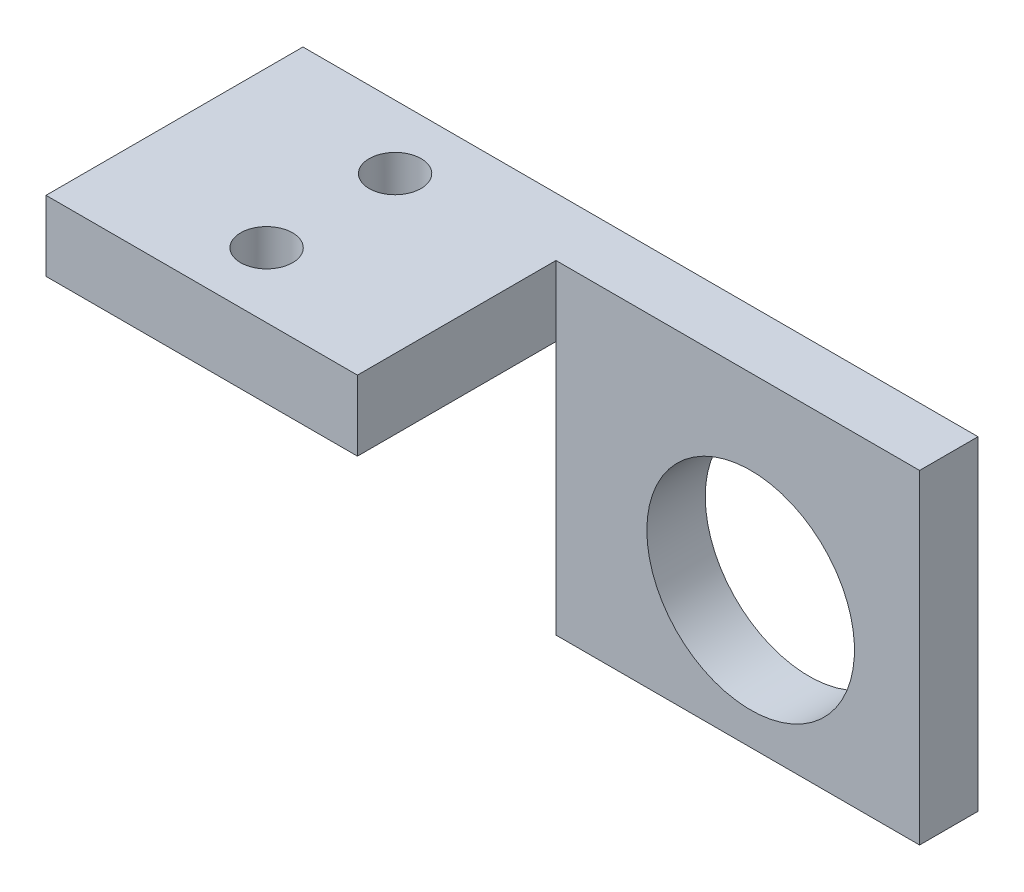
ISO-10303-21;
HEADER;
FILE_DESCRIPTION(('STEP AP214'),'2;1');
FILE_NAME('part.step','',(''),(''),'','','');
FILE_SCHEMA(('AUTOMOTIVE_DESIGN { 1 0 10303 214 1 1 1 1 }'));
ENDSEC;
DATA;
#1=APPLICATION_CONTEXT('core data for automotive mechanical design processes');
#2=APPLICATION_PROTOCOL_DEFINITION('international standard','automotive_design',2000,#1);
#3=PRODUCT_CONTEXT('',#1,'mechanical');
#4=PRODUCT('Part','Part','',(#3));
#5=PRODUCT_RELATED_PRODUCT_CATEGORY('part','',(#4));
#6=PRODUCT_DEFINITION_FORMATION('','',#4);
#7=PRODUCT_DEFINITION_CONTEXT('part definition',#1,'design');
#8=PRODUCT_DEFINITION('design','',#6,#7);
#9=PRODUCT_DEFINITION_SHAPE('','',#8);
#10=(LENGTH_UNIT() NAMED_UNIT(*) SI_UNIT(.MILLI.,.METRE.));
#11=(NAMED_UNIT(*) PLANE_ANGLE_UNIT() SI_UNIT($,.RADIAN.));
#12=(NAMED_UNIT(*) SI_UNIT($,.STERADIAN.) SOLID_ANGLE_UNIT());
#13=UNCERTAINTY_MEASURE_WITH_UNIT(LENGTH_MEASURE(1.E-05),#10,'distance_accuracy_value','');
#14=(GEOMETRIC_REPRESENTATION_CONTEXT(3) GLOBAL_UNCERTAINTY_ASSIGNED_CONTEXT((#13)) GLOBAL_UNIT_ASSIGNED_CONTEXT((#10,
#11,#12)) REPRESENTATION_CONTEXT('',''));
#15=CARTESIAN_POINT('',(0.,0.,0.));
#16=DIRECTION('',(0.,0.,1.));
#17=DIRECTION('',(1.,0.,0.));
#18=AXIS2_PLACEMENT_3D('',#15,#16,#17);
#19=CARTESIAN_POINT('',(0.,0.,4.8));
#20=DIRECTION('',(1.,0.,0.));
#21=DIRECTION('',(0.,1.,0.));
#22=AXIS2_PLACEMENT_3D('',#19,#20,#21);
#23=PLANE('',#22);
#24=DIRECTION('',(0.,0.,-1.));
#25=VECTOR('',#24,1.);
#26=CARTESIAN_POINT('',(0.,0.,4.8));
#27=LINE('',#26,#25);
#28=CARTESIAN_POINT('',(0.,0.,4.5));
#29=VERTEX_POINT('',#28);
#30=CARTESIAN_POINT('',(0.,0.,0.));
#31=VERTEX_POINT('',#30);
#32=EDGE_CURVE('E50',#29,#31,#27,.T.);
#33=ORIENTED_EDGE('',*,*,#32,.F.);
#34=DIRECTION('',(0.,1.,0.));
#35=VECTOR('',#34,1.);
#36=CARTESIAN_POINT('',(0.,-75.,4.5));
#37=LINE('',#36,#35);
#38=CARTESIAN_POINT('',(0.,19.59,4.5));
#39=VERTEX_POINT('',#38);
#40=EDGE_CURVE('E213',#29,#39,#37,.T.);
#41=ORIENTED_EDGE('',*,*,#40,.T.);
#42=DIRECTION('',(0.,0.,-1.));
#43=VECTOR('',#42,1.);
#44=CARTESIAN_POINT('',(0.,19.59,19.8));
#45=LINE('',#44,#43);
#46=CARTESIAN_POINT('',(0.,19.59,0.));
#47=VERTEX_POINT('',#46);
#48=EDGE_CURVE('E131',#39,#47,#45,.T.);
#49=ORIENTED_EDGE('',*,*,#48,.T.);
#50=DIRECTION('',(0.,-1.,0.));
#51=VECTOR('',#50,1.);
#52=CARTESIAN_POINT('',(0.,0.,0.));
#53=LINE('',#52,#51);
#54=EDGE_CURVE('E171',#47,#31,#53,.T.);
#55=ORIENTED_EDGE('',*,*,#54,.T.);
#56=EDGE_LOOP('',(#33,#41,#49,#55));
#57=FACE_BOUND('',#56,.T.);
#58=ADVANCED_FACE('F41',(#57),#23,.F.);
#59=CARTESIAN_POINT('',(0.,0.,4.8));
#60=DIRECTION('',(0.,1.,0.));
#61=DIRECTION('',(-1.,0.,0.));
#62=AXIS2_PLACEMENT_3D('',#59,#60,#61);
#63=PLANE('',#62);
#64=DIRECTION('',(0.,0.,-1.));
#65=VECTOR('',#64,1.);
#66=CARTESIAN_POINT('',(28.0184548601934,0.,200.));
#67=LINE('',#66,#65);
#68=CARTESIAN_POINT('',(28.0184548601934,0.,4.5));
#69=VERTEX_POINT('',#68);
#70=CARTESIAN_POINT('',(28.0184548601934,0.,0.));
#71=VERTEX_POINT('',#70);
#72=EDGE_CURVE('E64',#69,#71,#67,.T.);
#73=ORIENTED_EDGE('',*,*,#72,.F.);
#74=DIRECTION('',(-1.,0.,0.));
#75=VECTOR('',#74,1.);
#76=CARTESIAN_POINT('',(0.,0.,4.5));
#77=LINE('',#76,#75);
#78=EDGE_CURVE('E145',#69,#29,#77,.T.);
#79=ORIENTED_EDGE('',*,*,#78,.T.);
#80=ORIENTED_EDGE('',*,*,#32,.T.);
#81=DIRECTION('',(1.,0.,0.));
#82=VECTOR('',#81,1.);
#83=CARTESIAN_POINT('',(0.,0.,0.));
#84=LINE('',#83,#82);
#85=EDGE_CURVE('E175',#31,#71,#84,.T.);
#86=ORIENTED_EDGE('',*,*,#85,.T.);
#87=EDGE_LOOP('',(#73,#79,#80,#86));
#88=FACE_BOUND('',#87,.T.);
#89=ADVANCED_FACE('F202',(#88),#63,.F.);
#90=CARTESIAN_POINT('',(-23.9999999999999,0.,4.8));
#91=DIRECTION('',(1.,0.,0.));
#92=DIRECTION('',(0.,1.,0.));
#93=AXIS2_PLACEMENT_3D('',#90,#91,#92);
#94=PLANE('',#93);
#95=DIRECTION('',(0.,-1.,0.));
#96=VECTOR('',#95,1.);
#97=CARTESIAN_POINT('',(-23.9999999999999,0.,0.));
#98=LINE('',#97,#96);
#99=CARTESIAN_POINT('',(-24.,25.,0.));
#100=VERTEX_POINT('',#99);
#101=CARTESIAN_POINT('',(-23.9999999999999,19.59,0.));
#102=VERTEX_POINT('',#101);
#103=EDGE_CURVE('E129',#100,#102,#98,.T.);
#104=ORIENTED_EDGE('',*,*,#103,.T.);
#105=DIRECTION('',(0.,0.,-1.));
#106=VECTOR('',#105,1.);
#107=CARTESIAN_POINT('',(-23.9999999999999,19.59,19.8));
#108=LINE('',#107,#106);
#109=CARTESIAN_POINT('',(-23.9999999999999,19.59,19.8));
#110=VERTEX_POINT('',#109);
#111=EDGE_CURVE('E111',#110,#102,#108,.T.);
#112=ORIENTED_EDGE('',*,*,#111,.F.);
#113=DIRECTION('',(0.,-1.,0.));
#114=VECTOR('',#113,1.);
#115=CARTESIAN_POINT('',(-24.,25.,19.8));
#116=LINE('',#115,#114);
#117=CARTESIAN_POINT('',(-24.,25.,19.8));
#118=VERTEX_POINT('',#117);
#119=EDGE_CURVE('E127',#118,#110,#116,.T.);
#120=ORIENTED_EDGE('',*,*,#119,.F.);
#121=DIRECTION('',(0.,0.,1.));
#122=VECTOR('',#121,1.);
#123=CARTESIAN_POINT('',(-24.,25.,-90.2));
#124=LINE('',#123,#122);
#125=EDGE_CURVE('E155',#100,#118,#124,.T.);
#126=ORIENTED_EDGE('',*,*,#125,.F.);
#127=EDGE_LOOP('',(#104,#112,#120,#126));
#128=FACE_BOUND('',#127,.T.);
#129=ADVANCED_FACE('F125',(#128),#94,.F.);
#130=CARTESIAN_POINT('',(15.0000000000003,10.5,4.8));
#131=DIRECTION('',(0.,0.,-1.));
#132=DIRECTION('',(-1.,0.,0.));
#133=AXIS2_PLACEMENT_3D('',#130,#131,#132);
#134=CYLINDRICAL_SURFACE('',#133,8.);
#135=CARTESIAN_POINT('',(15.0000000000003,10.5,4.5));
#136=DIRECTION('',(0.,0.,-1.));
#137=DIRECTION('',(-1.,0.,0.));
#138=AXIS2_PLACEMENT_3D('',#135,#136,#137);
#139=CIRCLE('',#138,8.);
#140=CARTESIAN_POINT('',(7.00000000000033,10.5,4.5));
#141=VERTEX_POINT('',#140);
#142=EDGE_CURVE('E216',#141,#141,#139,.T.);
#143=ORIENTED_EDGE('',*,*,#142,.F.);
#144=EDGE_LOOP('',(#143));
#145=FACE_BOUND('',#144,.T.);
#146=CARTESIAN_POINT('',(15.0000000000003,10.5,0.));
#147=DIRECTION('',(0.,0.,1.00000000000002));
#148=DIRECTION('',(1.00000000000002,0.,0.));
#149=AXIS2_PLACEMENT_3D('',#146,#147,#148);
#150=CIRCLE('',#149,8.);
#151=CARTESIAN_POINT('',(23.0000000000005,10.5,0.));
#152=VERTEX_POINT('',#151);
#153=EDGE_CURVE('E180',#152,#152,#150,.T.);
#154=ORIENTED_EDGE('',*,*,#153,.F.);
#155=EDGE_LOOP('',(#154));
#156=FACE_BOUND('',#155,.T.);
#157=ADVANCED_FACE('F189',(#145,#156),#134,.F.);
#158=CARTESIAN_POINT('',(0.,0.,0.));
#159=DIRECTION('',(0.,0.,1.));
#160=DIRECTION('',(1.,0.,0.));
#161=AXIS2_PLACEMENT_3D('',#158,#159,#160);
#162=PLANE('',#161);
#163=ORIENTED_EDGE('',*,*,#54,.F.);
#164=DIRECTION('',(1.,0.,0.));
#165=VECTOR('',#164,1.);
#166=CARTESIAN_POINT('',(-23.9999999999999,19.59,0.));
#167=LINE('',#166,#165);
#168=EDGE_CURVE('E120',#102,#47,#167,.T.);
#169=ORIENTED_EDGE('',*,*,#168,.F.);
#170=ORIENTED_EDGE('',*,*,#103,.F.);
#171=DIRECTION('',(1.,0.,0.));
#172=VECTOR('',#171,1.);
#173=CARTESIAN_POINT('',(0.,25.,0.));
#174=LINE('',#173,#172);
#175=CARTESIAN_POINT('',(28.0184548601934,25.,0.));
#176=VERTEX_POINT('',#175);
#177=EDGE_CURVE('E162',#100,#176,#174,.T.);
#178=ORIENTED_EDGE('',*,*,#177,.T.);
#179=DIRECTION('',(0.,1.,0.));
#180=VECTOR('',#179,1.);
#181=CARTESIAN_POINT('',(28.0184548601934,102.7,0.));
#182=LINE('',#181,#180);
#183=EDGE_CURVE('E166',#71,#176,#182,.T.);
#184=ORIENTED_EDGE('',*,*,#183,.F.);
#185=ORIENTED_EDGE('',*,*,#85,.F.);
#186=EDGE_LOOP('',(#163,#169,#170,#178,#184,#185));
#187=FACE_BOUND('',#186,.T.);
#188=ORIENTED_EDGE('',*,*,#153,.T.);
#189=EDGE_LOOP('',(#188));
#190=FACE_BOUND('',#189,.T.);
#191=ADVANCED_FACE('F187',(#187,#190),#162,.F.);
#192=CARTESIAN_POINT('',(-12.0000000000001,0.,4.9));
#193=DIRECTION('',(0.,1.,0.));
#194=DIRECTION('',(-1.,0.,0.));
#195=AXIS2_PLACEMENT_3D('',#192,#193,#194);
#196=CYLINDRICAL_SURFACE('',#195,2.);
#197=CARTESIAN_POINT('',(-12.,19.59,4.9));
#198=DIRECTION('',(0.,1.,0.));
#199=DIRECTION('',(-1.,0.,0.));
#200=AXIS2_PLACEMENT_3D('',#197,#198,#199);
#201=CIRCLE('',#200,2.);
#202=CARTESIAN_POINT('',(-14.,19.59,4.9));
#203=VERTEX_POINT('',#202);
#204=EDGE_CURVE('E231',#203,#203,#201,.F.);
#205=ORIENTED_EDGE('',*,*,#204,.T.);
#206=EDGE_LOOP('',(#205));
#207=FACE_BOUND('',#206,.T.);
#208=CARTESIAN_POINT('',(-12.,25.,4.9));
#209=DIRECTION('',(0.,-1.,0.));
#210=DIRECTION('',(0.,0.,-1.));
#211=AXIS2_PLACEMENT_3D('',#208,#209,#210);
#212=CIRCLE('',#211,2.);
#213=CARTESIAN_POINT('',(-12.,25.,2.9));
#214=VERTEX_POINT('',#213);
#215=EDGE_CURVE('E158',#214,#214,#212,.F.);
#216=ORIENTED_EDGE('',*,*,#215,.T.);
#217=EDGE_LOOP('',(#216));
#218=FACE_BOUND('',#217,.T.);
#219=ADVANCED_FACE('F198',(#207,#218),#196,.F.);
#220=CARTESIAN_POINT('',(28.0184548601934,102.7,200.));
#221=DIRECTION('',(-1.,0.,0.));
#222=DIRECTION('',(0.,0.,1.));
#223=AXIS2_PLACEMENT_3D('',#220,#221,#222);
#224=PLANE('',#223);
#225=DIRECTION('',(0.,0.,1.));
#226=VECTOR('',#225,1.);
#227=CARTESIAN_POINT('',(28.0184548601934,25.,200.));
#228=LINE('',#227,#226);
#229=CARTESIAN_POINT('',(28.0184548601934,25.,4.5));
#230=VERTEX_POINT('',#229);
#231=EDGE_CURVE('E11',#176,#230,#228,.T.);
#232=ORIENTED_EDGE('',*,*,#231,.T.);
#233=DIRECTION('',(0.,1.,0.));
#234=VECTOR('',#233,1.);
#235=CARTESIAN_POINT('',(28.0184548601934,-75.,4.5));
#236=LINE('',#235,#234);
#237=EDGE_CURVE('E221',#69,#230,#236,.T.);
#238=ORIENTED_EDGE('',*,*,#237,.F.);
#239=ORIENTED_EDGE('',*,*,#72,.T.);
#240=ORIENTED_EDGE('',*,*,#183,.T.);
#241=EDGE_LOOP('',(#232,#238,#239,#240));
#242=FACE_BOUND('',#241,.T.);
#243=ADVANCED_FACE('F247',(#242),#224,.F.);
#244=CARTESIAN_POINT('',(-24.,25.,-90.2));
#245=DIRECTION('',(0.,-1.,0.));
#246=DIRECTION('',(0.,0.,-1.));
#247=AXIS2_PLACEMENT_3D('',#244,#245,#246);
#248=PLANE('',#247);
#249=CARTESIAN_POINT('',(-12.,25.,14.8));
#250=DIRECTION('',(0.,1.,0.));
#251=DIRECTION('',(0.,0.,1.));
#252=AXIS2_PLACEMENT_3D('',#249,#250,#251);
#253=CIRCLE('',#252,2.);
#254=CARTESIAN_POINT('',(-12.,25.,16.8));
#255=VERTEX_POINT('',#254);
#256=EDGE_CURVE('E139',#255,#255,#253,.T.);
#257=ORIENTED_EDGE('',*,*,#256,.F.);
#258=EDGE_LOOP('',(#257));
#259=FACE_BOUND('',#258,.T.);
#260=ORIENTED_EDGE('',*,*,#215,.F.);
#261=EDGE_LOOP('',(#260));
#262=FACE_BOUND('',#261,.T.);
#263=DIRECTION('',(0.,0.,-1.));
#264=VECTOR('',#263,1.);
#265=CARTESIAN_POINT('',(0.,25.,19.8));
#266=LINE('',#265,#264);
#267=CARTESIAN_POINT('',(0.,25.,19.8));
#268=VERTEX_POINT('',#267);
#269=CARTESIAN_POINT('',(0.,25.,4.5));
#270=VERTEX_POINT('',#269);
#271=EDGE_CURVE('E151',#268,#270,#266,.T.);
#272=ORIENTED_EDGE('',*,*,#271,.T.);
#273=DIRECTION('',(-1.,0.,0.));
#274=VECTOR('',#273,1.);
#275=CARTESIAN_POINT('',(0.,25.,4.5));
#276=LINE('',#275,#274);
#277=EDGE_CURVE('E225',#230,#270,#276,.T.);
#278=ORIENTED_EDGE('',*,*,#277,.F.);
#279=ORIENTED_EDGE('',*,*,#231,.F.);
#280=ORIENTED_EDGE('',*,*,#177,.F.);
#281=ORIENTED_EDGE('',*,*,#125,.T.);
#282=DIRECTION('',(-1.,0.,0.));
#283=VECTOR('',#282,1.);
#284=CARTESIAN_POINT('',(-24.,25.,19.8));
#285=LINE('',#284,#283);
#286=EDGE_CURVE('E136',#268,#118,#285,.T.);
#287=ORIENTED_EDGE('',*,*,#286,.F.);
#288=EDGE_LOOP('',(#272,#278,#279,#280,#281,#287));
#289=FACE_BOUND('',#288,.T.);
#290=ADVANCED_FACE('F246',(#259,#262,#289),#248,.F.);
#291=CARTESIAN_POINT('',(0.,25.,19.8));
#292=DIRECTION('',(-1.,0.,0.));
#293=DIRECTION('',(0.,0.,1.));
#294=AXIS2_PLACEMENT_3D('',#291,#292,#293);
#295=PLANE('',#294);
#296=DIRECTION('',(0.,1.,0.));
#297=VECTOR('',#296,1.);
#298=CARTESIAN_POINT('',(0.,25.,19.8));
#299=LINE('',#298,#297);
#300=CARTESIAN_POINT('',(0.,19.59,19.8));
#301=VERTEX_POINT('',#300);
#302=EDGE_CURVE('E138',#301,#268,#299,.T.);
#303=ORIENTED_EDGE('',*,*,#302,.F.);
#304=EDGE_CURVE('E115',#301,#39,#45,.T.);
#305=ORIENTED_EDGE('',*,*,#304,.T.);
#306=EDGE_CURVE('E224',#39,#270,#37,.T.);
#307=ORIENTED_EDGE('',*,*,#306,.T.);
#308=ORIENTED_EDGE('',*,*,#271,.F.);
#309=EDGE_LOOP('',(#303,#305,#307,#308));
#310=FACE_BOUND('',#309,.T.);
#311=ADVANCED_FACE('F241',(#310),#295,.F.);
#312=CARTESIAN_POINT('',(0.,0.,19.8));
#313=DIRECTION('',(0.,0.,1.));
#314=DIRECTION('',(1.,0.,0.));
#315=AXIS2_PLACEMENT_3D('',#312,#313,#314);
#316=PLANE('',#315);
#317=DIRECTION('',(1.,0.,0.));
#318=VECTOR('',#317,1.);
#319=CARTESIAN_POINT('',(-23.9999999999999,19.59,19.8));
#320=LINE('',#319,#318);
#321=EDGE_CURVE('E106',#110,#301,#320,.T.);
#322=ORIENTED_EDGE('',*,*,#321,.T.);
#323=ORIENTED_EDGE('',*,*,#302,.T.);
#324=ORIENTED_EDGE('',*,*,#286,.T.);
#325=ORIENTED_EDGE('',*,*,#119,.T.);
#326=EDGE_LOOP('',(#322,#323,#324,#325));
#327=FACE_BOUND('',#326,.T.);
#328=ADVANCED_FACE('F134',(#327),#316,.T.);
#329=CARTESIAN_POINT('',(-12.,15.,14.8));
#330=DIRECTION('',(0.,1.,0.));
#331=DIRECTION('',(0.,0.,1.));
#332=AXIS2_PLACEMENT_3D('',#329,#330,#331);
#333=CYLINDRICAL_SURFACE('',#332,2.);
#334=CARTESIAN_POINT('',(-12.,19.59,14.8));
#335=DIRECTION('',(0.,1.,0.));
#336=DIRECTION('',(-1.,0.,0.));
#337=AXIS2_PLACEMENT_3D('',#334,#335,#336);
#338=CIRCLE('',#337,2.);
#339=CARTESIAN_POINT('',(-14.,19.59,14.8));
#340=VERTEX_POINT('',#339);
#341=EDGE_CURVE('E44',#340,#340,#338,.F.);
#342=ORIENTED_EDGE('',*,*,#341,.T.);
#343=EDGE_LOOP('',(#342));
#344=FACE_BOUND('',#343,.T.);
#345=ORIENTED_EDGE('',*,*,#256,.T.);
#346=EDGE_LOOP('',(#345));
#347=FACE_BOUND('',#346,.T.);
#348=ADVANCED_FACE('F264',(#344,#347),#333,.F.);
#349=CARTESIAN_POINT('',(0.,-75.,4.5));
#350=DIRECTION('',(0.,0.,-1.));
#351=DIRECTION('',(-1.,0.,0.));
#352=AXIS2_PLACEMENT_3D('',#349,#350,#351);
#353=PLANE('',#352);
#354=ORIENTED_EDGE('',*,*,#142,.T.);
#355=EDGE_LOOP('',(#354));
#356=FACE_BOUND('',#355,.T.);
#357=ORIENTED_EDGE('',*,*,#237,.T.);
#358=ORIENTED_EDGE('',*,*,#277,.T.);
#359=ORIENTED_EDGE('',*,*,#306,.F.);
#360=ORIENTED_EDGE('',*,*,#40,.F.);
#361=ORIENTED_EDGE('',*,*,#78,.F.);
#362=EDGE_LOOP('',(#357,#358,#359,#360,#361));
#363=FACE_BOUND('',#362,.T.);
#364=ADVANCED_FACE('F243',(#356,#363),#353,.F.);
#365=CARTESIAN_POINT('',(-23.9999999999999,19.59,19.8));
#366=DIRECTION('',(0.,1.,0.));
#367=DIRECTION('',(-1.,0.,0.));
#368=AXIS2_PLACEMENT_3D('',#365,#366,#367);
#369=PLANE('',#368);
#370=ORIENTED_EDGE('',*,*,#341,.F.);
#371=EDGE_LOOP('',(#370));
#372=FACE_BOUND('',#371,.T.);
#373=ORIENTED_EDGE('',*,*,#168,.T.);
#374=ORIENTED_EDGE('',*,*,#48,.F.);
#375=ORIENTED_EDGE('',*,*,#304,.F.);
#376=ORIENTED_EDGE('',*,*,#321,.F.);
#377=ORIENTED_EDGE('',*,*,#111,.T.);
#378=EDGE_LOOP('',(#373,#374,#375,#376,#377));
#379=FACE_BOUND('',#378,.T.);
#380=ORIENTED_EDGE('',*,*,#204,.F.);
#381=EDGE_LOOP('',(#380));
#382=FACE_BOUND('',#381,.T.);
#383=ADVANCED_FACE('F109',(#372,#379,#382),#369,.F.);
#384=CLOSED_SHELL('',(#58,#89,#129,#157,#191,#219,#243,#290,#311,#328,#348,#364,#383));
#385=MANIFOLD_SOLID_BREP('B2',#384);
#386=ADVANCED_BREP_SHAPE_REPRESENTATION('',(#18,#385),#14);
#387=SHAPE_DEFINITION_REPRESENTATION(#9,#386);
ENDSEC;
END-ISO-10303-21;
